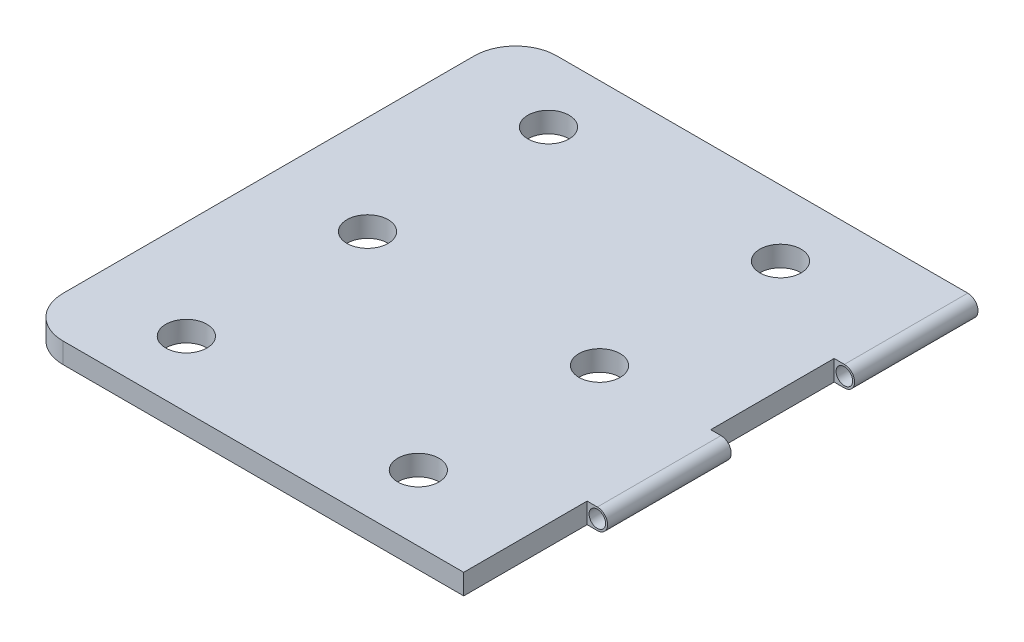
ISO-10303-21;
HEADER;
FILE_DESCRIPTION(('STEP AP214'),'2;1');
FILE_NAME('part.step','',(''),(''),'','','');
FILE_SCHEMA(('AUTOMOTIVE_DESIGN { 1 0 10303 214 1 1 1 1 }'));
ENDSEC;
DATA;
#1=APPLICATION_CONTEXT('core data for automotive mechanical design processes');
#2=APPLICATION_PROTOCOL_DEFINITION('international standard','automotive_design',2000,#1);
#3=PRODUCT_CONTEXT('',#1,'mechanical');
#4=PRODUCT('Part','Part','',(#3));
#5=PRODUCT_RELATED_PRODUCT_CATEGORY('part','',(#4));
#6=PRODUCT_DEFINITION_FORMATION('','',#4);
#7=PRODUCT_DEFINITION_CONTEXT('part definition',#1,'design');
#8=PRODUCT_DEFINITION('design','',#6,#7);
#9=PRODUCT_DEFINITION_SHAPE('','',#8);
#10=(LENGTH_UNIT() NAMED_UNIT(*) SI_UNIT(.MILLI.,.METRE.));
#11=(NAMED_UNIT(*) PLANE_ANGLE_UNIT() SI_UNIT($,.RADIAN.));
#12=(NAMED_UNIT(*) SI_UNIT($,.STERADIAN.) SOLID_ANGLE_UNIT());
#13=UNCERTAINTY_MEASURE_WITH_UNIT(LENGTH_MEASURE(1.E-05),#10,'distance_accuracy_value','');
#14=(GEOMETRIC_REPRESENTATION_CONTEXT(3) GLOBAL_UNCERTAINTY_ASSIGNED_CONTEXT((#13)) GLOBAL_UNIT_ASSIGNED_CONTEXT((#10,
#11,#12)) REPRESENTATION_CONTEXT('',''));
#15=CARTESIAN_POINT('',(0.,0.,0.));
#16=DIRECTION('',(0.,0.,1.));
#17=DIRECTION('',(1.,0.,0.));
#18=AXIS2_PLACEMENT_3D('',#15,#16,#17);
#19=CARTESIAN_POINT('',(0.,0.79,-19.05));
#20=DIRECTION('',(0.,0.,1.));
#21=DIRECTION('',(1.,0.,0.));
#22=AXIS2_PLACEMENT_3D('',#19,#20,#21);
#23=PLANE('',#22);
#24=CARTESIAN_POINT('',(17.445000028,0.395,-19.05));
#25=DIRECTION('',(0.,0.,1.));
#26=DIRECTION('',(1.,0.,0.));
#27=AXIS2_PLACEMENT_3D('',#24,#25,#26);
#28=CIRCLE('',#27,0.32);
#29=CARTESIAN_POINT('',(17.765000028,0.395,-19.05));
#30=VERTEX_POINT('',#29);
#31=EDGE_CURVE('E234',#30,#30,#28,.T.);
#32=ORIENTED_EDGE('',*,*,#31,.T.);
#33=EDGE_LOOP('',(#32));
#34=FACE_BOUND('',#33,.T.);
#35=DIRECTION('',(-1.,0.,0.));
#36=VECTOR('',#35,1.);
#37=CARTESIAN_POINT('',(0.,0.,-19.05));
#38=LINE('',#37,#36);
#39=CARTESIAN_POINT('',(17.445000028,0.,-19.05));
#40=VERTEX_POINT('',#39);
#41=CARTESIAN_POINT('',(1.590000122,0.,-19.05));
#42=VERTEX_POINT('',#41);
#43=EDGE_CURVE('E170',#40,#42,#38,.T.);
#44=ORIENTED_EDGE('',*,*,#43,.T.);
#45=DIRECTION('',(0.,-1.,0.));
#46=VECTOR('',#45,1.);
#47=CARTESIAN_POINT('',(1.590000122,0.79,-19.05));
#48=LINE('',#47,#46);
#49=CARTESIAN_POINT('',(1.590000122,0.79,-19.05));
#50=VERTEX_POINT('',#49);
#51=EDGE_CURVE('E101',#42,#50,#48,.F.);
#52=ORIENTED_EDGE('',*,*,#51,.T.);
#53=DIRECTION('',(-1.,0.,0.));
#54=VECTOR('',#53,1.);
#55=CARTESIAN_POINT('',(0.,0.79,-19.05));
#56=LINE('',#55,#54);
#57=CARTESIAN_POINT('',(17.445000028,0.79,-19.05));
#58=VERTEX_POINT('',#57);
#59=EDGE_CURVE('E171',#58,#50,#56,.T.);
#60=ORIENTED_EDGE('',*,*,#59,.F.);
#61=CARTESIAN_POINT('',(17.445000028,0.395,-19.05));
#62=DIRECTION('',(0.,0.,1.));
#63=DIRECTION('',(1.,0.,0.));
#64=AXIS2_PLACEMENT_3D('',#61,#62,#63);
#65=CIRCLE('',#64,0.395);
#66=EDGE_CURVE('E167',#40,#58,#65,.T.);
#67=ORIENTED_EDGE('',*,*,#66,.F.);
#68=EDGE_LOOP('',(#44,#52,#60,#67));
#69=FACE_BOUND('',#68,.T.);
#70=ADVANCED_FACE('F78',(#34,#69),#23,.F.);
#71=CARTESIAN_POINT('',(17.84,-1.75,-9.53));
#72=DIRECTION('',(0.,0.,1.));
#73=DIRECTION('',(1.,0.,0.));
#74=AXIS2_PLACEMENT_3D('',#71,#72,#73);
#75=PLANE('',#74);
#76=CARTESIAN_POINT('',(17.445000028,0.395,-9.53));
#77=DIRECTION('',(0.,0.,1.));
#78=DIRECTION('',(1.,0.,0.));
#79=AXIS2_PLACEMENT_3D('',#76,#77,#78);
#80=CIRCLE('',#79,0.32);
#81=CARTESIAN_POINT('',(17.765000028,0.395,-9.53));
#82=VERTEX_POINT('',#81);
#83=EDGE_CURVE('E416',#82,#82,#80,.T.);
#84=ORIENTED_EDGE('',*,*,#83,.T.);
#85=EDGE_LOOP('',(#84));
#86=FACE_BOUND('',#85,.T.);
#87=CARTESIAN_POINT('',(17.445000028,0.395,-9.53));
#88=DIRECTION('',(0.,0.,1.));
#89=DIRECTION('',(1.,0.,0.));
#90=AXIS2_PLACEMENT_3D('',#87,#88,#89);
#91=CIRCLE('',#90,0.395);
#92=CARTESIAN_POINT('',(17.445000028,0.,-9.53000000000001));
#93=VERTEX_POINT('',#92);
#94=CARTESIAN_POINT('',(17.445000028,0.79,-9.53));
#95=VERTEX_POINT('',#94);
#96=EDGE_CURVE('E346',#93,#95,#91,.T.);
#97=ORIENTED_EDGE('',*,*,#96,.F.);
#98=DIRECTION('',(-1.,0.,0.));
#99=VECTOR('',#98,1.);
#100=CARTESIAN_POINT('',(0.,0.,-9.53000000000008));
#101=LINE('',#100,#99);
#102=CARTESIAN_POINT('',(17.050000056,0.,-9.53));
#103=VERTEX_POINT('',#102);
#104=EDGE_CURVE('E202',#93,#103,#101,.T.);
#105=ORIENTED_EDGE('',*,*,#104,.T.);
#106=DIRECTION('',(0.,1.,0.));
#107=VECTOR('',#106,1.);
#108=CARTESIAN_POINT('',(17.050000056,-1.75,-9.53));
#109=LINE('',#108,#107);
#110=CARTESIAN_POINT('',(17.050000056,0.79,-9.53));
#111=VERTEX_POINT('',#110);
#112=EDGE_CURVE('E209',#103,#111,#109,.T.);
#113=ORIENTED_EDGE('',*,*,#112,.T.);
#114=DIRECTION('',(1.,0.,0.));
#115=VECTOR('',#114,1.);
#116=CARTESIAN_POINT('',(17.84,0.79,-9.53));
#117=LINE('',#116,#115);
#118=EDGE_CURVE('E357',#111,#95,#117,.T.);
#119=ORIENTED_EDGE('',*,*,#118,.T.);
#120=EDGE_LOOP('',(#97,#105,#113,#119));
#121=FACE_BOUND('',#120,.T.);
#122=ADVANCED_FACE('F269',(#86,#121),#75,.F.);
#123=CARTESIAN_POINT('',(17.84,-1.75,-14.29));
#124=DIRECTION('',(0.,0.,-1.));
#125=DIRECTION('',(-1.,0.,0.));
#126=AXIS2_PLACEMENT_3D('',#123,#124,#125);
#127=PLANE('',#126);
#128=CARTESIAN_POINT('',(17.445000028,0.395,-14.29));
#129=DIRECTION('',(0.,0.,-1.));
#130=DIRECTION('',(-1.,0.,0.));
#131=AXIS2_PLACEMENT_3D('',#128,#129,#130);
#132=CIRCLE('',#131,0.32);
#133=CARTESIAN_POINT('',(17.125000028,0.395,-14.29));
#134=VERTEX_POINT('',#133);
#135=EDGE_CURVE('E233',#134,#134,#132,.T.);
#136=ORIENTED_EDGE('',*,*,#135,.T.);
#137=EDGE_LOOP('',(#136));
#138=FACE_BOUND('',#137,.T.);
#139=DIRECTION('',(1.,0.,0.));
#140=VECTOR('',#139,1.);
#141=CARTESIAN_POINT('',(0.,0.,-14.29));
#142=LINE('',#141,#140);
#143=CARTESIAN_POINT('',(17.050000056,0.,-14.29));
#144=VERTEX_POINT('',#143);
#145=CARTESIAN_POINT('',(17.445000028,0.,-14.29));
#146=VERTEX_POINT('',#145);
#147=EDGE_CURVE('E197',#144,#146,#142,.T.);
#148=ORIENTED_EDGE('',*,*,#147,.T.);
#149=CARTESIAN_POINT('',(17.445000028,0.395,-14.29));
#150=DIRECTION('',(0.,0.,-1.));
#151=DIRECTION('',(-1.,0.,0.));
#152=AXIS2_PLACEMENT_3D('',#149,#150,#151);
#153=CIRCLE('',#152,0.395);
#154=CARTESIAN_POINT('',(17.445000028,0.79,-14.29));
#155=VERTEX_POINT('',#154);
#156=EDGE_CURVE('E180',#155,#146,#153,.T.);
#157=ORIENTED_EDGE('',*,*,#156,.F.);
#158=DIRECTION('',(-1.,0.,0.));
#159=VECTOR('',#158,1.);
#160=CARTESIAN_POINT('',(17.84,0.79,-14.29));
#161=LINE('',#160,#159);
#162=CARTESIAN_POINT('',(17.050000056,0.79,-14.29));
#163=VERTEX_POINT('',#162);
#164=EDGE_CURVE('E369',#155,#163,#161,.T.);
#165=ORIENTED_EDGE('',*,*,#164,.T.);
#166=DIRECTION('',(0.,1.,0.));
#167=VECTOR('',#166,1.);
#168=CARTESIAN_POINT('',(17.050000056,-1.75,-14.29));
#169=LINE('',#168,#167);
#170=EDGE_CURVE('E364',#144,#163,#169,.T.);
#171=ORIENTED_EDGE('',*,*,#170,.F.);
#172=EDGE_LOOP('',(#148,#157,#165,#171));
#173=FACE_BOUND('',#172,.T.);
#174=ADVANCED_FACE('F275',(#138,#173),#127,.F.);
#175=CARTESIAN_POINT('',(17.84,-1.75,-4.76));
#176=DIRECTION('',(0.,0.,-1.));
#177=DIRECTION('',(-1.,0.,0.));
#178=AXIS2_PLACEMENT_3D('',#175,#176,#177);
#179=PLANE('',#178);
#180=CARTESIAN_POINT('',(17.445000028,0.395,-4.76));
#181=DIRECTION('',(0.,0.,-1.));
#182=DIRECTION('',(-1.,0.,0.));
#183=AXIS2_PLACEMENT_3D('',#180,#181,#182);
#184=CIRCLE('',#183,0.32);
#185=CARTESIAN_POINT('',(17.125000028,0.395,-4.76));
#186=VERTEX_POINT('',#185);
#187=EDGE_CURVE('E230',#186,#186,#184,.T.);
#188=ORIENTED_EDGE('',*,*,#187,.T.);
#189=EDGE_LOOP('',(#188));
#190=FACE_BOUND('',#189,.T.);
#191=DIRECTION('',(1.,0.,0.));
#192=VECTOR('',#191,1.);
#193=CARTESIAN_POINT('',(0.,0.,-4.75999999999998));
#194=LINE('',#193,#192);
#195=CARTESIAN_POINT('',(17.050000056,0.,-4.76));
#196=VERTEX_POINT('',#195);
#197=CARTESIAN_POINT('',(17.445000028,0.,-4.76000000000001));
#198=VERTEX_POINT('',#197);
#199=EDGE_CURVE('E204',#196,#198,#194,.T.);
#200=ORIENTED_EDGE('',*,*,#199,.T.);
#201=CARTESIAN_POINT('',(17.445000028,0.395,-4.76));
#202=DIRECTION('',(0.,0.,-1.));
#203=DIRECTION('',(-1.,0.,0.));
#204=AXIS2_PLACEMENT_3D('',#201,#202,#203);
#205=CIRCLE('',#204,0.395);
#206=CARTESIAN_POINT('',(17.445000028,0.79,-4.76));
#207=VERTEX_POINT('',#206);
#208=EDGE_CURVE('E229',#207,#198,#205,.T.);
#209=ORIENTED_EDGE('',*,*,#208,.F.);
#210=DIRECTION('',(-1.,0.,0.));
#211=VECTOR('',#210,1.);
#212=CARTESIAN_POINT('',(17.84,0.79,-4.76));
#213=LINE('',#212,#211);
#214=CARTESIAN_POINT('',(17.050000056,0.79,-4.76));
#215=VERTEX_POINT('',#214);
#216=EDGE_CURVE('E359',#207,#215,#213,.T.);
#217=ORIENTED_EDGE('',*,*,#216,.T.);
#218=DIRECTION('',(0.,1.,0.));
#219=VECTOR('',#218,1.);
#220=CARTESIAN_POINT('',(17.050000056,-1.75,-4.76));
#221=LINE('',#220,#219);
#222=EDGE_CURVE('E383',#196,#215,#221,.T.);
#223=ORIENTED_EDGE('',*,*,#222,.F.);
#224=EDGE_LOOP('',(#200,#209,#217,#223));
#225=FACE_BOUND('',#224,.T.);
#226=ADVANCED_FACE('F294',(#190,#225),#179,.F.);
#227=CARTESIAN_POINT('',(0.,0.,0.));
#228=DIRECTION('',(0.,-1.,0.));
#229=DIRECTION('',(0.,0.,-1.));
#230=AXIS2_PLACEMENT_3D('',#227,#228,#229);
#231=PLANE('',#230);
#232=CARTESIAN_POINT('',(12.76,0.,-2.54));
#233=DIRECTION('',(0.,-1.,0.));
#234=DIRECTION('',(0.,0.,-1.));
#235=AXIS2_PLACEMENT_3D('',#232,#233,#234);
#236=CIRCLE('',#235,0.795000000000001);
#237=CARTESIAN_POINT('',(12.76,0.,-3.335));
#238=VERTEX_POINT('',#237);
#239=EDGE_CURVE('E221',#238,#238,#236,.T.);
#240=ORIENTED_EDGE('',*,*,#239,.F.);
#241=EDGE_LOOP('',(#240));
#242=FACE_BOUND('',#241,.T.);
#243=CARTESIAN_POINT('',(3.81,0.,-2.54));
#244=DIRECTION('',(0.,-1.,0.));
#245=DIRECTION('',(0.,0.,-1.));
#246=AXIS2_PLACEMENT_3D('',#243,#244,#245);
#247=CIRCLE('',#246,0.795);
#248=CARTESIAN_POINT('',(3.81,0.,-3.335));
#249=VERTEX_POINT('',#248);
#250=EDGE_CURVE('E218',#249,#249,#247,.T.);
#251=ORIENTED_EDGE('',*,*,#250,.F.);
#252=EDGE_LOOP('',(#251));
#253=FACE_BOUND('',#252,.T.);
#254=CARTESIAN_POINT('',(3.81,0.,-9.53));
#255=DIRECTION('',(0.,-1.,0.));
#256=DIRECTION('',(0.,0.,-1.));
#257=AXIS2_PLACEMENT_3D('',#254,#255,#256);
#258=CIRCLE('',#257,0.795);
#259=CARTESIAN_POINT('',(3.81,0.,-10.325));
#260=VERTEX_POINT('',#259);
#261=EDGE_CURVE('E215',#260,#260,#258,.T.);
#262=ORIENTED_EDGE('',*,*,#261,.F.);
#263=EDGE_LOOP('',(#262));
#264=FACE_BOUND('',#263,.T.);
#265=CARTESIAN_POINT('',(12.76,0.,-9.53));
#266=DIRECTION('',(0.,-1.,0.));
#267=DIRECTION('',(0.,0.,-1.));
#268=AXIS2_PLACEMENT_3D('',#265,#266,#267);
#269=CIRCLE('',#268,0.795000000000001);
#270=CARTESIAN_POINT('',(12.76,0.,-10.325));
#271=VERTEX_POINT('',#270);
#272=EDGE_CURVE('E212',#271,#271,#269,.T.);
#273=ORIENTED_EDGE('',*,*,#272,.F.);
#274=EDGE_LOOP('',(#273));
#275=FACE_BOUND('',#274,.T.);
#276=CARTESIAN_POINT('',(12.76,0.,-16.51));
#277=DIRECTION('',(0.,-1.,0.));
#278=DIRECTION('',(0.,0.,-1.));
#279=AXIS2_PLACEMENT_3D('',#276,#277,#278);
#280=CIRCLE('',#279,0.795000000000001);
#281=CARTESIAN_POINT('',(12.76,0.,-17.305));
#282=VERTEX_POINT('',#281);
#283=EDGE_CURVE('E208',#282,#282,#280,.T.);
#284=ORIENTED_EDGE('',*,*,#283,.F.);
#285=EDGE_LOOP('',(#284));
#286=FACE_BOUND('',#285,.T.);
#287=CARTESIAN_POINT('',(3.81,0.,-16.51));
#288=DIRECTION('',(0.,-1.,0.));
#289=DIRECTION('',(0.,0.,-1.));
#290=AXIS2_PLACEMENT_3D('',#287,#288,#289);
#291=CIRCLE('',#290,0.795000000000002);
#292=CARTESIAN_POINT('',(3.81,0.,-17.305));
#293=VERTEX_POINT('',#292);
#294=EDGE_CURVE('E205',#293,#293,#291,.T.);
#295=ORIENTED_EDGE('',*,*,#294,.F.);
#296=EDGE_LOOP('',(#295));
#297=FACE_BOUND('',#296,.T.);
#298=DIRECTION('',(0.,0.,1.));
#299=VECTOR('',#298,1.);
#300=CARTESIAN_POINT('',(0.,0.,0.));
#301=LINE('',#300,#299);
#302=CARTESIAN_POINT('',(0.,0.,-17.459999878));
#303=VERTEX_POINT('',#302);
#304=CARTESIAN_POINT('',(0.,0.,-1.590000122));
#305=VERTEX_POINT('',#304);
#306=EDGE_CURVE('E193',#303,#305,#301,.T.);
#307=ORIENTED_EDGE('',*,*,#306,.F.);
#308=CARTESIAN_POINT('',(1.590000122,0.,-17.459999878));
#309=DIRECTION('',(0.,-1.,0.));
#310=DIRECTION('',(0.,0.,-1.));
#311=AXIS2_PLACEMENT_3D('',#308,#309,#310);
#312=CIRCLE('',#311,1.590000122);
#313=EDGE_CURVE('E187',#303,#42,#312,.T.);
#314=ORIENTED_EDGE('',*,*,#313,.T.);
#315=ORIENTED_EDGE('',*,*,#43,.F.);
#316=DIRECTION('',(0.,0.,1.));
#317=VECTOR('',#316,1.);
#318=CARTESIAN_POINT('',(17.445000028,0.,-19.05));
#319=LINE('',#318,#317);
#320=EDGE_CURVE('E175',#40,#146,#319,.T.);
#321=ORIENTED_EDGE('',*,*,#320,.T.);
#322=ORIENTED_EDGE('',*,*,#147,.F.);
#323=DIRECTION('',(0.,0.,-1.));
#324=VECTOR('',#323,1.);
#325=CARTESIAN_POINT('',(17.050000056,0.,0.));
#326=LINE('',#325,#324);
#327=EDGE_CURVE('E199',#103,#144,#326,.T.);
#328=ORIENTED_EDGE('',*,*,#327,.F.);
#329=ORIENTED_EDGE('',*,*,#104,.F.);
#330=DIRECTION('',(0.,0.,1.));
#331=VECTOR('',#330,1.);
#332=CARTESIAN_POINT('',(17.445000028,0.,-19.05));
#333=LINE('',#332,#331);
#334=EDGE_CURVE('E236',#93,#198,#333,.T.);
#335=ORIENTED_EDGE('',*,*,#334,.T.);
#336=ORIENTED_EDGE('',*,*,#199,.F.);
#337=DIRECTION('',(0.,0.,-1.));
#338=VECTOR('',#337,1.);
#339=CARTESIAN_POINT('',(17.050000056,0.,0.));
#340=LINE('',#339,#338);
#341=CARTESIAN_POINT('',(17.050000056,0.,0.));
#342=VERTEX_POINT('',#341);
#343=EDGE_CURVE('E226',#342,#196,#340,.T.);
#344=ORIENTED_EDGE('',*,*,#343,.F.);
#345=DIRECTION('',(1.,0.,0.));
#346=VECTOR('',#345,1.);
#347=CARTESIAN_POINT('',(0.,0.,0.));
#348=LINE('',#347,#346);
#349=CARTESIAN_POINT('',(1.590000122,0.,0.));
#350=VERTEX_POINT('',#349);
#351=EDGE_CURVE('E189',#350,#342,#348,.T.);
#352=ORIENTED_EDGE('',*,*,#351,.F.);
#353=CARTESIAN_POINT('',(1.590000122,0.,-1.590000122));
#354=DIRECTION('',(0.,-1.,0.));
#355=DIRECTION('',(0.,0.,-1.));
#356=AXIS2_PLACEMENT_3D('',#353,#354,#355);
#357=CIRCLE('',#356,1.590000122);
#358=EDGE_CURVE('E244',#350,#305,#357,.T.);
#359=ORIENTED_EDGE('',*,*,#358,.T.);
#360=EDGE_LOOP('',(#307,#314,#315,#321,#322,#328,#329,#335,#336,#344,#352,#359));
#361=FACE_BOUND('',#360,.T.);
#362=ADVANCED_FACE('F186',(#242,#253,#264,#275,#286,#297,#361),#231,.T.);
#363=CARTESIAN_POINT('',(0.,0.79,0.));
#364=DIRECTION('',(0.,-1.,0.));
#365=DIRECTION('',(0.,0.,-1.));
#366=AXIS2_PLACEMENT_3D('',#363,#364,#365);
#367=PLANE('',#366);
#368=CARTESIAN_POINT('',(12.76,0.79,-2.54));
#369=DIRECTION('',(0.,1.,0.));
#370=DIRECTION('',(0.,0.,1.));
#371=AXIS2_PLACEMENT_3D('',#368,#369,#370);
#372=CIRCLE('',#371,0.795000000000001);
#373=CARTESIAN_POINT('',(12.76,0.79,-1.745));
#374=VERTEX_POINT('',#373);
#375=EDGE_CURVE('E391',#374,#374,#372,.T.);
#376=ORIENTED_EDGE('',*,*,#375,.F.);
#377=EDGE_LOOP('',(#376));
#378=FACE_BOUND('',#377,.T.);
#379=CARTESIAN_POINT('',(3.81,0.79,-2.54));
#380=DIRECTION('',(0.,1.,0.));
#381=DIRECTION('',(0.,0.,1.));
#382=AXIS2_PLACEMENT_3D('',#379,#380,#381);
#383=CIRCLE('',#382,0.795);
#384=CARTESIAN_POINT('',(3.81,0.79,-1.745));
#385=VERTEX_POINT('',#384);
#386=EDGE_CURVE('E394',#385,#385,#383,.T.);
#387=ORIENTED_EDGE('',*,*,#386,.F.);
#388=EDGE_LOOP('',(#387));
#389=FACE_BOUND('',#388,.T.);
#390=CARTESIAN_POINT('',(3.81,0.79,-9.53));
#391=DIRECTION('',(0.,1.,0.));
#392=DIRECTION('',(0.,0.,1.));
#393=AXIS2_PLACEMENT_3D('',#390,#391,#392);
#394=CIRCLE('',#393,0.795);
#395=CARTESIAN_POINT('',(3.81,0.79,-8.735));
#396=VERTEX_POINT('',#395);
#397=EDGE_CURVE('E397',#396,#396,#394,.T.);
#398=ORIENTED_EDGE('',*,*,#397,.F.);
#399=EDGE_LOOP('',(#398));
#400=FACE_BOUND('',#399,.T.);
#401=CARTESIAN_POINT('',(12.76,0.79,-9.53));
#402=DIRECTION('',(0.,1.,0.));
#403=DIRECTION('',(0.,0.,1.));
#404=AXIS2_PLACEMENT_3D('',#401,#402,#403);
#405=CIRCLE('',#404,0.795000000000001);
#406=CARTESIAN_POINT('',(12.76,0.79,-8.735));
#407=VERTEX_POINT('',#406);
#408=EDGE_CURVE('E399',#407,#407,#405,.T.);
#409=ORIENTED_EDGE('',*,*,#408,.F.);
#410=EDGE_LOOP('',(#409));
#411=FACE_BOUND('',#410,.T.);
#412=CARTESIAN_POINT('',(12.76,0.79,-16.51));
#413=DIRECTION('',(0.,1.,0.));
#414=DIRECTION('',(0.,0.,1.));
#415=AXIS2_PLACEMENT_3D('',#412,#413,#414);
#416=CIRCLE('',#415,0.795000000000001);
#417=CARTESIAN_POINT('',(12.76,0.79,-15.715));
#418=VERTEX_POINT('',#417);
#419=EDGE_CURVE('E403',#418,#418,#416,.T.);
#420=ORIENTED_EDGE('',*,*,#419,.F.);
#421=EDGE_LOOP('',(#420));
#422=FACE_BOUND('',#421,.T.);
#423=CARTESIAN_POINT('',(3.81,0.79,-16.51));
#424=DIRECTION('',(0.,1.,0.));
#425=DIRECTION('',(0.,0.,1.));
#426=AXIS2_PLACEMENT_3D('',#423,#424,#425);
#427=CIRCLE('',#426,0.795000000000002);
#428=CARTESIAN_POINT('',(3.81,0.79,-15.715));
#429=VERTEX_POINT('',#428);
#430=EDGE_CURVE('E352',#429,#429,#427,.T.);
#431=ORIENTED_EDGE('',*,*,#430,.F.);
#432=EDGE_LOOP('',(#431));
#433=FACE_BOUND('',#432,.T.);
#434=ORIENTED_EDGE('',*,*,#59,.T.);
#435=CARTESIAN_POINT('',(1.590000122,0.79,-17.459999878));
#436=DIRECTION('',(0.,-1.,0.));
#437=DIRECTION('',(0.,0.,-1.));
#438=AXIS2_PLACEMENT_3D('',#435,#436,#437);
#439=CIRCLE('',#438,1.590000122);
#440=CARTESIAN_POINT('',(0.,0.79,-17.459999878));
#441=VERTEX_POINT('',#440);
#442=EDGE_CURVE('E86',#50,#441,#439,.F.);
#443=ORIENTED_EDGE('',*,*,#442,.T.);
#444=DIRECTION('',(0.,0.,1.));
#445=VECTOR('',#444,1.);
#446=CARTESIAN_POINT('',(0.,0.79,0.));
#447=LINE('',#446,#445);
#448=CARTESIAN_POINT('',(0.,0.79,-1.590000122));
#449=VERTEX_POINT('',#448);
#450=EDGE_CURVE('E188',#441,#449,#447,.T.);
#451=ORIENTED_EDGE('',*,*,#450,.T.);
#452=CARTESIAN_POINT('',(1.590000122,0.79,-1.590000122));
#453=DIRECTION('',(0.,-1.,0.));
#454=DIRECTION('',(0.,0.,-1.));
#455=AXIS2_PLACEMENT_3D('',#452,#453,#454);
#456=CIRCLE('',#455,1.590000122);
#457=CARTESIAN_POINT('',(1.590000122,0.79,0.));
#458=VERTEX_POINT('',#457);
#459=EDGE_CURVE('E93',#449,#458,#456,.F.);
#460=ORIENTED_EDGE('',*,*,#459,.T.);
#461=DIRECTION('',(1.,0.,0.));
#462=VECTOR('',#461,1.);
#463=CARTESIAN_POINT('',(0.,0.79,0.));
#464=LINE('',#463,#462);
#465=CARTESIAN_POINT('',(17.050000056,0.79,0.));
#466=VERTEX_POINT('',#465);
#467=EDGE_CURVE('E191',#458,#466,#464,.T.);
#468=ORIENTED_EDGE('',*,*,#467,.T.);
#469=DIRECTION('',(0.,0.,1.));
#470=VECTOR('',#469,1.);
#471=CARTESIAN_POINT('',(17.050000056,0.79,0.));
#472=LINE('',#471,#470);
#473=EDGE_CURVE('E385',#215,#466,#472,.T.);
#474=ORIENTED_EDGE('',*,*,#473,.F.);
#475=ORIENTED_EDGE('',*,*,#216,.F.);
#476=DIRECTION('',(0.,0.,1.));
#477=VECTOR('',#476,1.);
#478=CARTESIAN_POINT('',(17.445000028,0.79,-19.05));
#479=LINE('',#478,#477);
#480=EDGE_CURVE('E174',#95,#207,#479,.T.);
#481=ORIENTED_EDGE('',*,*,#480,.F.);
#482=ORIENTED_EDGE('',*,*,#118,.F.);
#483=DIRECTION('',(0.,0.,1.));
#484=VECTOR('',#483,1.);
#485=CARTESIAN_POINT('',(17.050000056,0.79,-14.29));
#486=LINE('',#485,#484);
#487=EDGE_CURVE('E365',#163,#111,#486,.T.);
#488=ORIENTED_EDGE('',*,*,#487,.F.);
#489=ORIENTED_EDGE('',*,*,#164,.F.);
#490=EDGE_CURVE('E360',#58,#155,#479,.T.);
#491=ORIENTED_EDGE('',*,*,#490,.F.);
#492=EDGE_LOOP('',(#434,#443,#451,#460,#468,#474,#475,#481,#482,#488,#489,#491));
#493=FACE_BOUND('',#492,.T.);
#494=ADVANCED_FACE('F250',(#378,#389,#400,#411,#422,#433,#493),#367,.F.);
#495=CARTESIAN_POINT('',(0.,0.79,0.));
#496=DIRECTION('',(1.,0.,0.));
#497=DIRECTION('',(0.,0.,-1.));
#498=AXIS2_PLACEMENT_3D('',#495,#496,#497);
#499=PLANE('',#498);
#500=ORIENTED_EDGE('',*,*,#450,.F.);
#501=DIRECTION('',(0.,-1.,0.));
#502=VECTOR('',#501,1.);
#503=CARTESIAN_POINT('',(0.,0.79,-17.459999878));
#504=LINE('',#503,#502);
#505=EDGE_CURVE('E241',#441,#303,#504,.T.);
#506=ORIENTED_EDGE('',*,*,#505,.T.);
#507=ORIENTED_EDGE('',*,*,#306,.T.);
#508=DIRECTION('',(0.,-1.,0.));
#509=VECTOR('',#508,1.);
#510=CARTESIAN_POINT('',(0.,0.79,-1.590000122));
#511=LINE('',#510,#509);
#512=EDGE_CURVE('E239',#305,#449,#511,.F.);
#513=ORIENTED_EDGE('',*,*,#512,.T.);
#514=EDGE_LOOP('',(#500,#506,#507,#513));
#515=FACE_BOUND('',#514,.T.);
#516=ADVANCED_FACE('F254',(#515),#499,.F.);
#517=CARTESIAN_POINT('',(0.,0.79,0.));
#518=DIRECTION('',(0.,0.,-1.));
#519=DIRECTION('',(-1.,0.,0.));
#520=AXIS2_PLACEMENT_3D('',#517,#518,#519);
#521=PLANE('',#520);
#522=ORIENTED_EDGE('',*,*,#467,.F.);
#523=DIRECTION('',(0.,-1.,0.));
#524=VECTOR('',#523,1.);
#525=CARTESIAN_POINT('',(1.590000122,0.79,0.));
#526=LINE('',#525,#524);
#527=EDGE_CURVE('E12',#458,#350,#526,.T.);
#528=ORIENTED_EDGE('',*,*,#527,.T.);
#529=ORIENTED_EDGE('',*,*,#351,.T.);
#530=DIRECTION('',(0.,1.,0.));
#531=VECTOR('',#530,1.);
#532=CARTESIAN_POINT('',(17.050000056,-1.75,0.));
#533=LINE('',#532,#531);
#534=EDGE_CURVE('E384',#342,#466,#533,.T.);
#535=ORIENTED_EDGE('',*,*,#534,.T.);
#536=EDGE_LOOP('',(#522,#528,#529,#535));
#537=FACE_BOUND('',#536,.T.);
#538=ADVANCED_FACE('F282',(#537),#521,.F.);
#539=CARTESIAN_POINT('',(17.050000056,-1.75,-14.29));
#540=DIRECTION('',(-1.,0.,0.));
#541=DIRECTION('',(0.,0.,1.));
#542=AXIS2_PLACEMENT_3D('',#539,#540,#541);
#543=PLANE('',#542);
#544=ORIENTED_EDGE('',*,*,#327,.T.);
#545=ORIENTED_EDGE('',*,*,#170,.T.);
#546=ORIENTED_EDGE('',*,*,#487,.T.);
#547=ORIENTED_EDGE('',*,*,#112,.F.);
#548=EDGE_LOOP('',(#544,#545,#546,#547));
#549=FACE_BOUND('',#548,.T.);
#550=ADVANCED_FACE('F284',(#549),#543,.F.);
#551=CARTESIAN_POINT('',(3.81,-1.75,-16.51));
#552=DIRECTION('',(0.,1.,0.));
#553=DIRECTION('',(0.,0.,1.));
#554=AXIS2_PLACEMENT_3D('',#551,#552,#553);
#555=CYLINDRICAL_SURFACE('',#554,0.795000000000002);
#556=ORIENTED_EDGE('',*,*,#294,.T.);
#557=EDGE_LOOP('',(#556));
#558=FACE_BOUND('',#557,.T.);
#559=ORIENTED_EDGE('',*,*,#430,.T.);
#560=EDGE_LOOP('',(#559));
#561=FACE_BOUND('',#560,.T.);
#562=ADVANCED_FACE('F303',(#558,#561),#555,.F.);
#563=CARTESIAN_POINT('',(12.76,-1.75,-16.51));
#564=DIRECTION('',(0.,1.,0.));
#565=DIRECTION('',(0.,0.,1.));
#566=AXIS2_PLACEMENT_3D('',#563,#564,#565);
#567=CYLINDRICAL_SURFACE('',#566,0.795000000000001);
#568=ORIENTED_EDGE('',*,*,#283,.T.);
#569=EDGE_LOOP('',(#568));
#570=FACE_BOUND('',#569,.T.);
#571=ORIENTED_EDGE('',*,*,#419,.T.);
#572=EDGE_LOOP('',(#571));
#573=FACE_BOUND('',#572,.T.);
#574=ADVANCED_FACE('F329',(#570,#573),#567,.F.);
#575=CARTESIAN_POINT('',(12.76,-1.75,-9.53));
#576=DIRECTION('',(0.,1.,0.));
#577=DIRECTION('',(0.,0.,1.));
#578=AXIS2_PLACEMENT_3D('',#575,#576,#577);
#579=CYLINDRICAL_SURFACE('',#578,0.795000000000001);
#580=ORIENTED_EDGE('',*,*,#272,.T.);
#581=EDGE_LOOP('',(#580));
#582=FACE_BOUND('',#581,.T.);
#583=ORIENTED_EDGE('',*,*,#408,.T.);
#584=EDGE_LOOP('',(#583));
#585=FACE_BOUND('',#584,.T.);
#586=ADVANCED_FACE('F310',(#582,#585),#579,.F.);
#587=CARTESIAN_POINT('',(3.81,-1.75,-9.53));
#588=DIRECTION('',(0.,1.,0.));
#589=DIRECTION('',(0.,0.,1.));
#590=AXIS2_PLACEMENT_3D('',#587,#588,#589);
#591=CYLINDRICAL_SURFACE('',#590,0.795);
#592=ORIENTED_EDGE('',*,*,#261,.T.);
#593=EDGE_LOOP('',(#592));
#594=FACE_BOUND('',#593,.T.);
#595=ORIENTED_EDGE('',*,*,#397,.T.);
#596=EDGE_LOOP('',(#595));
#597=FACE_BOUND('',#596,.T.);
#598=ADVANCED_FACE('F306',(#594,#597),#591,.F.);
#599=CARTESIAN_POINT('',(3.81,-1.75,-2.54));
#600=DIRECTION('',(0.,1.,0.));
#601=DIRECTION('',(0.,0.,1.));
#602=AXIS2_PLACEMENT_3D('',#599,#600,#601);
#603=CYLINDRICAL_SURFACE('',#602,0.795);
#604=ORIENTED_EDGE('',*,*,#250,.T.);
#605=EDGE_LOOP('',(#604));
#606=FACE_BOUND('',#605,.T.);
#607=ORIENTED_EDGE('',*,*,#386,.T.);
#608=EDGE_LOOP('',(#607));
#609=FACE_BOUND('',#608,.T.);
#610=ADVANCED_FACE('F309',(#606,#609),#603,.F.);
#611=CARTESIAN_POINT('',(12.76,-1.75,-2.54));
#612=DIRECTION('',(0.,1.,0.));
#613=DIRECTION('',(0.,0.,1.));
#614=AXIS2_PLACEMENT_3D('',#611,#612,#613);
#615=CYLINDRICAL_SURFACE('',#614,0.795000000000001);
#616=ORIENTED_EDGE('',*,*,#239,.T.);
#617=EDGE_LOOP('',(#616));
#618=FACE_BOUND('',#617,.T.);
#619=ORIENTED_EDGE('',*,*,#375,.T.);
#620=EDGE_LOOP('',(#619));
#621=FACE_BOUND('',#620,.T.);
#622=ADVANCED_FACE('F314',(#618,#621),#615,.F.);
#623=CARTESIAN_POINT('',(17.050000056,-1.75,0.));
#624=DIRECTION('',(-1.,0.,0.));
#625=DIRECTION('',(0.,0.,1.));
#626=AXIS2_PLACEMENT_3D('',#623,#624,#625);
#627=PLANE('',#626);
#628=ORIENTED_EDGE('',*,*,#343,.T.);
#629=ORIENTED_EDGE('',*,*,#222,.T.);
#630=ORIENTED_EDGE('',*,*,#473,.T.);
#631=ORIENTED_EDGE('',*,*,#534,.F.);
#632=EDGE_LOOP('',(#628,#629,#630,#631));
#633=FACE_BOUND('',#632,.T.);
#634=ADVANCED_FACE('F318',(#633),#627,.F.);
#635=CARTESIAN_POINT('',(17.445000028,0.395,-19.05));
#636=DIRECTION('',(0.,0.,1.));
#637=DIRECTION('',(1.,0.,0.));
#638=AXIS2_PLACEMENT_3D('',#635,#636,#637);
#639=CYLINDRICAL_SURFACE('',#638,0.32);
#640=ORIENTED_EDGE('',*,*,#187,.F.);
#641=EDGE_LOOP('',(#640));
#642=FACE_BOUND('',#641,.T.);
#643=ORIENTED_EDGE('',*,*,#83,.F.);
#644=EDGE_LOOP('',(#643));
#645=FACE_BOUND('',#644,.T.);
#646=ADVANCED_FACE('F325',(#642,#645),#639,.F.);
#647=CARTESIAN_POINT('',(17.445000028,0.395,-19.05));
#648=DIRECTION('',(0.,0.,1.));
#649=DIRECTION('',(1.,0.,0.));
#650=AXIS2_PLACEMENT_3D('',#647,#648,#649);
#651=CYLINDRICAL_SURFACE('',#650,0.395);
#652=ORIENTED_EDGE('',*,*,#96,.T.);
#653=ORIENTED_EDGE('',*,*,#480,.T.);
#654=ORIENTED_EDGE('',*,*,#208,.T.);
#655=ORIENTED_EDGE('',*,*,#334,.F.);
#656=EDGE_LOOP('',(#652,#653,#654,#655));
#657=FACE_BOUND('',#656,.T.);
#658=ADVANCED_FACE('F266',(#657),#651,.T.);
#659=ORIENTED_EDGE('',*,*,#31,.F.);
#660=EDGE_LOOP('',(#659));
#661=FACE_BOUND('',#660,.T.);
#662=ORIENTED_EDGE('',*,*,#135,.F.);
#663=EDGE_LOOP('',(#662));
#664=FACE_BOUND('',#663,.T.);
#665=ADVANCED_FACE('F264',(#661,#664),#639,.F.);
#666=ORIENTED_EDGE('',*,*,#156,.T.);
#667=ORIENTED_EDGE('',*,*,#320,.F.);
#668=ORIENTED_EDGE('',*,*,#66,.T.);
#669=ORIENTED_EDGE('',*,*,#490,.T.);
#670=EDGE_LOOP('',(#666,#667,#668,#669));
#671=FACE_BOUND('',#670,.T.);
#672=ADVANCED_FACE('F178',(#671),#651,.T.);
#673=CARTESIAN_POINT('',(1.590000122,0.79,-17.459999878));
#674=DIRECTION('',(0.,-1.,0.));
#675=DIRECTION('',(0.,0.,-1.));
#676=AXIS2_PLACEMENT_3D('',#673,#674,#675);
#677=CYLINDRICAL_SURFACE('',#676,1.590000122);
#678=ORIENTED_EDGE('',*,*,#442,.F.);
#679=ORIENTED_EDGE('',*,*,#51,.F.);
#680=ORIENTED_EDGE('',*,*,#313,.F.);
#681=ORIENTED_EDGE('',*,*,#505,.F.);
#682=EDGE_LOOP('',(#678,#679,#680,#681));
#683=FACE_BOUND('',#682,.T.);
#684=ADVANCED_FACE('F257',(#683),#677,.T.);
#685=CARTESIAN_POINT('',(1.590000122,0.79,-1.590000122));
#686=DIRECTION('',(0.,-1.,0.));
#687=DIRECTION('',(0.,0.,-1.));
#688=AXIS2_PLACEMENT_3D('',#685,#686,#687);
#689=CYLINDRICAL_SURFACE('',#688,1.590000122);
#690=ORIENTED_EDGE('',*,*,#459,.F.);
#691=ORIENTED_EDGE('',*,*,#512,.F.);
#692=ORIENTED_EDGE('',*,*,#358,.F.);
#693=ORIENTED_EDGE('',*,*,#527,.F.);
#694=EDGE_LOOP('',(#690,#691,#692,#693));
#695=FACE_BOUND('',#694,.T.);
#696=ADVANCED_FACE('F80',(#695),#689,.T.);
#697=CLOSED_SHELL('',(#70,#122,#174,#226,#362,#494,#516,#538,#550,#562,#574,#586,#598,#610,#622,
#634,#646,#658,#665,#672,#684,#696));
#698=MANIFOLD_SOLID_BREP('B2',#697);
#699=ADVANCED_BREP_SHAPE_REPRESENTATION('',(#18,#698),#14);
#700=SHAPE_DEFINITION_REPRESENTATION(#9,#699);
ENDSEC;
END-ISO-10303-21;
